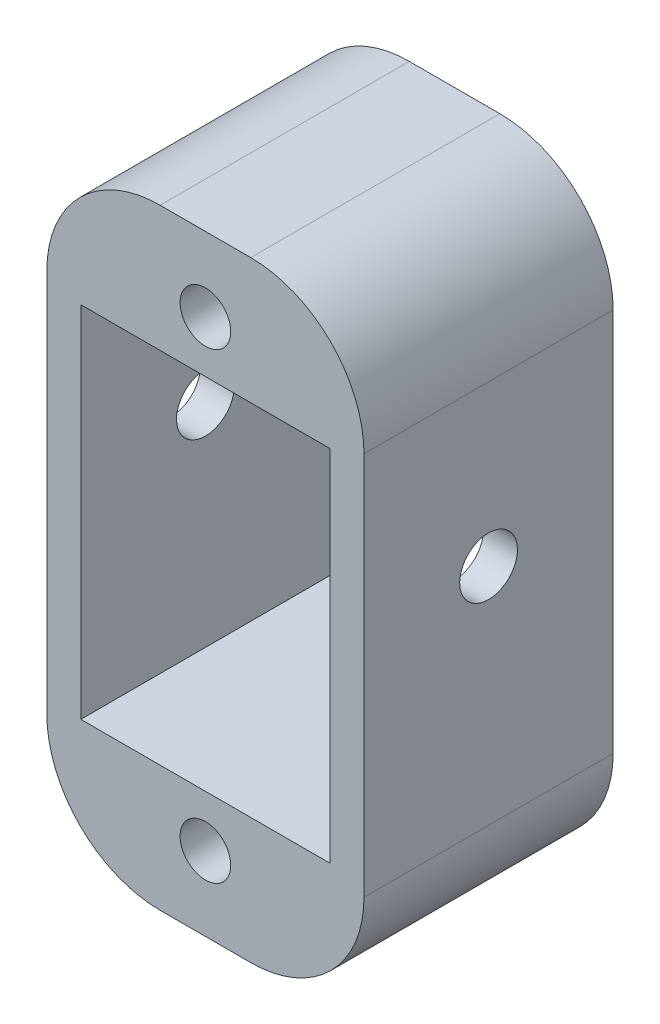
ISO-10303-21;
HEADER;
FILE_DESCRIPTION(('STEP AP214'),'2;1');
FILE_NAME('part.step','',(''),(''),'','','');
FILE_SCHEMA(('AUTOMOTIVE_DESIGN { 1 0 10303 214 1 1 1 1 }'));
ENDSEC;
DATA;
#1=APPLICATION_CONTEXT('core data for automotive mechanical design processes');
#2=APPLICATION_PROTOCOL_DEFINITION('international standard','automotive_design',2000,#1);
#3=PRODUCT_CONTEXT('',#1,'mechanical');
#4=PRODUCT('Part','Part','',(#3));
#5=PRODUCT_RELATED_PRODUCT_CATEGORY('part','',(#4));
#6=PRODUCT_DEFINITION_FORMATION('','',#4);
#7=PRODUCT_DEFINITION_CONTEXT('part definition',#1,'design');
#8=PRODUCT_DEFINITION('design','',#6,#7);
#9=PRODUCT_DEFINITION_SHAPE('','',#8);
#10=(LENGTH_UNIT() NAMED_UNIT(*) SI_UNIT(.MILLI.,.METRE.));
#11=(NAMED_UNIT(*) PLANE_ANGLE_UNIT() SI_UNIT($,.RADIAN.));
#12=(NAMED_UNIT(*) SI_UNIT($,.STERADIAN.) SOLID_ANGLE_UNIT());
#13=UNCERTAINTY_MEASURE_WITH_UNIT(LENGTH_MEASURE(1.E-05),#10,'distance_accuracy_value','');
#14=(GEOMETRIC_REPRESENTATION_CONTEXT(3) GLOBAL_UNCERTAINTY_ASSIGNED_CONTEXT((#13)) GLOBAL_UNIT_ASSIGNED_CONTEXT((#10,
#11,#12)) REPRESENTATION_CONTEXT('',''));
#15=CARTESIAN_POINT('',(0.,0.,0.));
#16=DIRECTION('',(0.,0.,1.));
#17=DIRECTION('',(1.,0.,0.));
#18=AXIS2_PLACEMENT_3D('',#15,#16,#17);
#19=CARTESIAN_POINT('',(3.88591708481307,-17.5541678256387,22.));
#20=DIRECTION('',(0.,0.,1.));
#21=DIRECTION('',(1.,0.,0.));
#22=AXIS2_PLACEMENT_3D('',#19,#20,#21);
#23=PLANE('',#22);
#24=CARTESIAN_POINT('',(-0.114082915186937,19.8058321743613,22.));
#25=DIRECTION('',(0.,0.,1.));
#26=DIRECTION('',(1.,0.,0.));
#27=AXIS2_PLACEMENT_3D('',#24,#25,#26);
#28=CIRCLE('',#27,2.23522254429092);
#29=CARTESIAN_POINT('',(2.12113962910399,19.8058321743613,22.));
#30=VERTEX_POINT('',#29);
#31=EDGE_CURVE('E155',#30,#30,#28,.T.);
#32=ORIENTED_EDGE('',*,*,#31,.F.);
#33=EDGE_LOOP('',(#32));
#34=FACE_BOUND('',#33,.T.);
#35=CARTESIAN_POINT('',(-0.114082915186937,-21.0041678256387,22.));
#36=DIRECTION('',(0.,0.,1.));
#37=DIRECTION('',(1.,0.,0.));
#38=AXIS2_PLACEMENT_3D('',#35,#36,#37);
#39=CIRCLE('',#38,2.23522254429093);
#40=CARTESIAN_POINT('',(2.12113962910399,-21.0041678256387,22.));
#41=VERTEX_POINT('',#40);
#42=EDGE_CURVE('E308',#41,#41,#39,.T.);
#43=ORIENTED_EDGE('',*,*,#42,.F.);
#44=EDGE_LOOP('',(#43));
#45=FACE_BOUND('',#44,.T.);
#46=CARTESIAN_POINT('',(3.88591708481307,-17.5541678256387,22.));
#47=DIRECTION('',(0.,0.,1.));
#48=DIRECTION('',(1.,0.,0.));
#49=AXIS2_PLACEMENT_3D('',#46,#47,#48);
#50=CIRCLE('',#49,10.);
#51=CARTESIAN_POINT('',(3.885917084813,-27.5541678256387,22.));
#52=VERTEX_POINT('',#51);
#53=CARTESIAN_POINT('',(13.8859170848131,-17.5541678256387,22.));
#54=VERTEX_POINT('',#53);
#55=EDGE_CURVE('E165',#52,#54,#50,.T.);
#56=ORIENTED_EDGE('',*,*,#55,.T.);
#57=DIRECTION('',(0.,1.,0.));
#58=VECTOR('',#57,1.);
#59=CARTESIAN_POINT('',(13.8859170848131,16.3558321743612,22.));
#60=LINE('',#59,#58);
#61=CARTESIAN_POINT('',(13.8859170848131,16.3558321743612,22.));
#62=VERTEX_POINT('',#61);
#63=EDGE_CURVE('E168',#54,#62,#60,.T.);
#64=ORIENTED_EDGE('',*,*,#63,.T.);
#65=CARTESIAN_POINT('',(3.88591708481306,16.3558321743613,22.));
#66=DIRECTION('',(0.,0.,1.));
#67=DIRECTION('',(-1.,0.,0.));
#68=AXIS2_PLACEMENT_3D('',#65,#66,#67);
#69=CIRCLE('',#68,10.);
#70=CARTESIAN_POINT('',(3.88591708481299,26.3558321743613,22.));
#71=VERTEX_POINT('',#70);
#72=EDGE_CURVE('E171',#62,#71,#69,.T.);
#73=ORIENTED_EDGE('',*,*,#72,.T.);
#74=DIRECTION('',(-1.,0.,0.));
#75=VECTOR('',#74,1.);
#76=CARTESIAN_POINT('',(-4.11408291518687,26.3558321743613,22.));
#77=LINE('',#76,#75);
#78=CARTESIAN_POINT('',(-4.11408291518686,26.3558321743613,22.));
#79=VERTEX_POINT('',#78);
#80=EDGE_CURVE('E173',#71,#79,#77,.T.);
#81=ORIENTED_EDGE('',*,*,#80,.T.);
#82=CARTESIAN_POINT('',(-4.11408291518694,16.3558321743613,22.));
#83=DIRECTION('',(0.,0.,1.));
#84=DIRECTION('',(1.,0.,0.));
#85=AXIS2_PLACEMENT_3D('',#82,#83,#84);
#86=CIRCLE('',#85,10.);
#87=CARTESIAN_POINT('',(-14.1140829151869,16.3558321743612,22.));
#88=VERTEX_POINT('',#87);
#89=EDGE_CURVE('E175',#79,#88,#86,.T.);
#90=ORIENTED_EDGE('',*,*,#89,.T.);
#91=DIRECTION('',(0.,-1.,0.));
#92=VECTOR('',#91,1.);
#93=CARTESIAN_POINT('',(-14.1140829151869,16.3558321743612,22.));
#94=LINE('',#93,#92);
#95=CARTESIAN_POINT('',(-14.1140829151869,-17.5541678256387,22.));
#96=VERTEX_POINT('',#95);
#97=EDGE_CURVE('E177',#88,#96,#94,.T.);
#98=ORIENTED_EDGE('',*,*,#97,.T.);
#99=CARTESIAN_POINT('',(-4.11408291518693,-17.5541678256387,22.));
#100=DIRECTION('',(0.,0.,1.));
#101=DIRECTION('',(1.,0.,0.));
#102=AXIS2_PLACEMENT_3D('',#99,#100,#101);
#103=CIRCLE('',#102,10.);
#104=CARTESIAN_POINT('',(-4.11408291518686,-27.5541678256387,22.));
#105=VERTEX_POINT('',#104);
#106=EDGE_CURVE('E179',#96,#105,#103,.T.);
#107=ORIENTED_EDGE('',*,*,#106,.T.);
#108=DIRECTION('',(1.,0.,0.));
#109=VECTOR('',#108,1.);
#110=CARTESIAN_POINT('',(-4.11408291518686,-27.5541678256387,22.));
#111=LINE('',#110,#109);
#112=EDGE_CURVE('E181',#105,#52,#111,.T.);
#113=ORIENTED_EDGE('',*,*,#112,.T.);
#114=EDGE_LOOP('',(#56,#64,#73,#81,#90,#98,#107,#113));
#115=FACE_BOUND('',#114,.T.);
#116=DIRECTION('',(1.,0.,0.));
#117=VECTOR('',#116,1.);
#118=CARTESIAN_POINT('',(10.8859170848131,-16.4541678256387,22.));
#119=LINE('',#118,#117);
#120=CARTESIAN_POINT('',(-11.1140829151869,-16.4541678256387,22.));
#121=VERTEX_POINT('',#120);
#122=CARTESIAN_POINT('',(10.8859170848131,-16.4541678256387,22.));
#123=VERTEX_POINT('',#122);
#124=EDGE_CURVE('E135',#121,#123,#119,.T.);
#125=ORIENTED_EDGE('',*,*,#124,.F.);
#126=DIRECTION('',(0.,-1.,0.));
#127=VECTOR('',#126,1.);
#128=CARTESIAN_POINT('',(-11.1140829151869,-16.4541678256387,22.));
#129=LINE('',#128,#127);
#130=CARTESIAN_POINT('',(-11.1140829151869,15.2558321743613,22.));
#131=VERTEX_POINT('',#130);
#132=EDGE_CURVE('E127',#131,#121,#129,.T.);
#133=ORIENTED_EDGE('',*,*,#132,.F.);
#134=DIRECTION('',(-1.,0.,0.));
#135=VECTOR('',#134,1.);
#136=CARTESIAN_POINT('',(-11.1140829151869,15.2558321743613,22.));
#137=LINE('',#136,#135);
#138=CARTESIAN_POINT('',(10.8859170848131,15.2558321743613,22.));
#139=VERTEX_POINT('',#138);
#140=EDGE_CURVE('E149',#139,#131,#137,.T.);
#141=ORIENTED_EDGE('',*,*,#140,.F.);
#142=DIRECTION('',(0.,1.,0.));
#143=VECTOR('',#142,1.);
#144=CARTESIAN_POINT('',(10.8859170848131,15.2558321743613,22.));
#145=LINE('',#144,#143);
#146=EDGE_CURVE('E147',#123,#139,#145,.T.);
#147=ORIENTED_EDGE('',*,*,#146,.F.);
#148=EDGE_LOOP('',(#125,#133,#141,#147));
#149=FACE_BOUND('',#148,.T.);
#150=ADVANCED_FACE('F37',(#34,#45,#115,#149),#23,.T.);
#151=CARTESIAN_POINT('',(3.88591708481307,-17.5541678256387,0.));
#152=DIRECTION('',(0.,0.,1.));
#153=DIRECTION('',(1.,0.,0.));
#154=AXIS2_PLACEMENT_3D('',#151,#152,#153);
#155=PLANE('',#154);
#156=CARTESIAN_POINT('',(-0.114082915186937,19.8058321743613,0.));
#157=DIRECTION('',(0.,0.,1.));
#158=DIRECTION('',(1.,0.,0.));
#159=AXIS2_PLACEMENT_3D('',#156,#157,#158);
#160=CIRCLE('',#159,2.23522254429092);
#161=CARTESIAN_POINT('',(2.12113962910399,19.8058321743613,0.));
#162=VERTEX_POINT('',#161);
#163=EDGE_CURVE('E305',#162,#162,#160,.T.);
#164=ORIENTED_EDGE('',*,*,#163,.T.);
#165=EDGE_LOOP('',(#164));
#166=FACE_BOUND('',#165,.T.);
#167=CARTESIAN_POINT('',(-0.114082915186937,-21.0041678256387,0.));
#168=DIRECTION('',(0.,0.,1.));
#169=DIRECTION('',(1.,0.,0.));
#170=AXIS2_PLACEMENT_3D('',#167,#168,#169);
#171=CIRCLE('',#170,2.23522254429093);
#172=CARTESIAN_POINT('',(2.12113962910399,-21.0041678256387,0.));
#173=VERTEX_POINT('',#172);
#174=EDGE_CURVE('E297',#173,#173,#171,.T.);
#175=ORIENTED_EDGE('',*,*,#174,.T.);
#176=EDGE_LOOP('',(#175));
#177=FACE_BOUND('',#176,.T.);
#178=CARTESIAN_POINT('',(3.88591708481307,-17.5541678256387,0.));
#179=DIRECTION('',(0.,0.,1.));
#180=DIRECTION('',(1.,0.,0.));
#181=AXIS2_PLACEMENT_3D('',#178,#179,#180);
#182=CIRCLE('',#181,10.);
#183=CARTESIAN_POINT('',(3.885917084813,-27.5541678256387,0.));
#184=VERTEX_POINT('',#183);
#185=CARTESIAN_POINT('',(13.8859170848131,-17.5541678256387,0.));
#186=VERTEX_POINT('',#185);
#187=EDGE_CURVE('E143',#184,#186,#182,.T.);
#188=ORIENTED_EDGE('',*,*,#187,.F.);
#189=DIRECTION('',(1.,0.,0.));
#190=VECTOR('',#189,1.);
#191=CARTESIAN_POINT('',(-4.11408291518686,-27.5541678256387,0.));
#192=LINE('',#191,#190);
#193=CARTESIAN_POINT('',(-4.11408291518686,-27.5541678256387,0.));
#194=VERTEX_POINT('',#193);
#195=EDGE_CURVE('E169',#194,#184,#192,.T.);
#196=ORIENTED_EDGE('',*,*,#195,.F.);
#197=CARTESIAN_POINT('',(-4.11408291518693,-17.5541678256387,0.));
#198=DIRECTION('',(0.,0.,1.));
#199=DIRECTION('',(1.,0.,0.));
#200=AXIS2_PLACEMENT_3D('',#197,#198,#199);
#201=CIRCLE('',#200,10.);
#202=CARTESIAN_POINT('',(-14.1140829151869,-17.5541678256387,0.));
#203=VERTEX_POINT('',#202);
#204=EDGE_CURVE('E196',#203,#194,#201,.T.);
#205=ORIENTED_EDGE('',*,*,#204,.F.);
#206=DIRECTION('',(0.,-1.,0.));
#207=VECTOR('',#206,1.);
#208=CARTESIAN_POINT('',(-14.1140829151869,16.3558321743612,0.));
#209=LINE('',#208,#207);
#210=CARTESIAN_POINT('',(-14.1140829151869,16.3558321743612,0.));
#211=VERTEX_POINT('',#210);
#212=EDGE_CURVE('E194',#211,#203,#209,.T.);
#213=ORIENTED_EDGE('',*,*,#212,.F.);
#214=CARTESIAN_POINT('',(-4.11408291518694,16.3558321743613,0.));
#215=DIRECTION('',(0.,0.,1.));
#216=DIRECTION('',(1.,0.,0.));
#217=AXIS2_PLACEMENT_3D('',#214,#215,#216);
#218=CIRCLE('',#217,10.);
#219=CARTESIAN_POINT('',(-4.11408291518686,26.3558321743613,0.));
#220=VERTEX_POINT('',#219);
#221=EDGE_CURVE('E192',#220,#211,#218,.T.);
#222=ORIENTED_EDGE('',*,*,#221,.F.);
#223=DIRECTION('',(-1.,0.,0.));
#224=VECTOR('',#223,1.);
#225=CARTESIAN_POINT('',(-4.11408291518687,26.3558321743613,0.));
#226=LINE('',#225,#224);
#227=CARTESIAN_POINT('',(3.88591708481299,26.3558321743613,0.));
#228=VERTEX_POINT('',#227);
#229=EDGE_CURVE('E190',#228,#220,#226,.T.);
#230=ORIENTED_EDGE('',*,*,#229,.F.);
#231=CARTESIAN_POINT('',(3.88591708481306,16.3558321743613,0.));
#232=DIRECTION('',(0.,0.,1.));
#233=DIRECTION('',(-1.,0.,0.));
#234=AXIS2_PLACEMENT_3D('',#231,#232,#233);
#235=CIRCLE('',#234,10.);
#236=CARTESIAN_POINT('',(13.8859170848131,16.3558321743612,0.));
#237=VERTEX_POINT('',#236);
#238=EDGE_CURVE('E188',#237,#228,#235,.T.);
#239=ORIENTED_EDGE('',*,*,#238,.F.);
#240=DIRECTION('',(0.,1.,0.));
#241=VECTOR('',#240,1.);
#242=CARTESIAN_POINT('',(13.8859170848131,16.3558321743612,0.));
#243=LINE('',#242,#241);
#244=EDGE_CURVE('E186',#186,#237,#243,.T.);
#245=ORIENTED_EDGE('',*,*,#244,.F.);
#246=EDGE_LOOP('',(#188,#196,#205,#213,#222,#230,#239,#245));
#247=FACE_BOUND('',#246,.T.);
#248=DIRECTION('',(0.,-1.,0.));
#249=VECTOR('',#248,1.);
#250=CARTESIAN_POINT('',(-11.1140829151869,-16.4541678256387,0.));
#251=LINE('',#250,#249);
#252=CARTESIAN_POINT('',(-11.1140829151869,15.2558321743613,0.));
#253=VERTEX_POINT('',#252);
#254=CARTESIAN_POINT('',(-11.1140829151869,-16.4541678256387,0.));
#255=VERTEX_POINT('',#254);
#256=EDGE_CURVE('E61',#253,#255,#251,.T.);
#257=ORIENTED_EDGE('',*,*,#256,.T.);
#258=DIRECTION('',(1.,0.,0.));
#259=VECTOR('',#258,1.);
#260=CARTESIAN_POINT('',(10.8859170848131,-16.4541678256387,0.));
#261=LINE('',#260,#259);
#262=CARTESIAN_POINT('',(10.8859170848131,-16.4541678256387,0.));
#263=VERTEX_POINT('',#262);
#264=EDGE_CURVE('E142',#255,#263,#261,.T.);
#265=ORIENTED_EDGE('',*,*,#264,.T.);
#266=DIRECTION('',(0.,1.,0.));
#267=VECTOR('',#266,1.);
#268=CARTESIAN_POINT('',(10.8859170848131,15.2558321743613,0.));
#269=LINE('',#268,#267);
#270=CARTESIAN_POINT('',(10.8859170848131,15.2558321743613,0.));
#271=VERTEX_POINT('',#270);
#272=EDGE_CURVE('E157',#263,#271,#269,.T.);
#273=ORIENTED_EDGE('',*,*,#272,.T.);
#274=DIRECTION('',(-1.,0.,0.));
#275=VECTOR('',#274,1.);
#276=CARTESIAN_POINT('',(-11.1140829151869,15.2558321743613,0.));
#277=LINE('',#276,#275);
#278=EDGE_CURVE('E136',#271,#253,#277,.T.);
#279=ORIENTED_EDGE('',*,*,#278,.T.);
#280=EDGE_LOOP('',(#257,#265,#273,#279));
#281=FACE_BOUND('',#280,.T.);
#282=ADVANCED_FACE('F227',(#166,#177,#247,#281),#155,.F.);
#283=CARTESIAN_POINT('',(3.88591708481307,-17.5541678256387,22.));
#284=DIRECTION('',(0.,0.,-1.));
#285=DIRECTION('',(-1.,0.,0.));
#286=AXIS2_PLACEMENT_3D('',#283,#284,#285);
#287=CYLINDRICAL_SURFACE('',#286,10.);
#288=ORIENTED_EDGE('',*,*,#187,.T.);
#289=DIRECTION('',(0.,0.,-1.));
#290=VECTOR('',#289,1.);
#291=CARTESIAN_POINT('',(13.8859170848131,-17.5541678256387,22.));
#292=LINE('',#291,#290);
#293=EDGE_CURVE('E11',#54,#186,#292,.T.);
#294=ORIENTED_EDGE('',*,*,#293,.F.);
#295=ORIENTED_EDGE('',*,*,#55,.F.);
#296=DIRECTION('',(0.,0.,-1.));
#297=VECTOR('',#296,1.);
#298=CARTESIAN_POINT('',(3.885917084813,-27.5541678256387,22.));
#299=LINE('',#298,#297);
#300=EDGE_CURVE('E183',#52,#184,#299,.T.);
#301=ORIENTED_EDGE('',*,*,#300,.T.);
#302=EDGE_LOOP('',(#288,#294,#295,#301));
#303=FACE_BOUND('',#302,.T.);
#304=ADVANCED_FACE('F39',(#303),#287,.T.);
#305=CARTESIAN_POINT('',(13.8859170848131,16.3558321743612,22.));
#306=DIRECTION('',(-1.,0.,0.));
#307=DIRECTION('',(0.,-1.,0.));
#308=AXIS2_PLACEMENT_3D('',#305,#306,#307);
#309=PLANE('',#308);
#310=CARTESIAN_POINT('',(13.8859170848131,2.25583217436127,11.));
#311=DIRECTION('',(-1.,0.,0.));
#312=DIRECTION('',(0.,-1.,0.));
#313=AXIS2_PLACEMENT_3D('',#310,#311,#312);
#314=CIRCLE('',#313,2.55);
#315=CARTESIAN_POINT('',(13.8859170848131,-0.294167825638735,11.));
#316=VERTEX_POINT('',#315);
#317=EDGE_CURVE('E294',#316,#316,#314,.T.);
#318=ORIENTED_EDGE('',*,*,#317,.T.);
#319=EDGE_LOOP('',(#318));
#320=FACE_BOUND('',#319,.T.);
#321=ORIENTED_EDGE('',*,*,#244,.T.);
#322=DIRECTION('',(0.,0.,-1.));
#323=VECTOR('',#322,1.);
#324=CARTESIAN_POINT('',(13.8859170848131,16.3558321743612,22.));
#325=LINE('',#324,#323);
#326=EDGE_CURVE('E46',#62,#237,#325,.T.);
#327=ORIENTED_EDGE('',*,*,#326,.F.);
#328=ORIENTED_EDGE('',*,*,#63,.F.);
#329=ORIENTED_EDGE('',*,*,#293,.T.);
#330=EDGE_LOOP('',(#321,#327,#328,#329));
#331=FACE_BOUND('',#330,.T.);
#332=ADVANCED_FACE('F244',(#320,#331),#309,.F.);
#333=CARTESIAN_POINT('',(3.88591708481306,16.3558321743613,22.));
#334=DIRECTION('',(0.,0.,-1.));
#335=DIRECTION('',(-1.,0.,0.));
#336=AXIS2_PLACEMENT_3D('',#333,#334,#335);
#337=CYLINDRICAL_SURFACE('',#336,10.);
#338=ORIENTED_EDGE('',*,*,#238,.T.);
#339=DIRECTION('',(0.,0.,-1.));
#340=VECTOR('',#339,1.);
#341=CARTESIAN_POINT('',(3.88591708481299,26.3558321743613,22.));
#342=LINE('',#341,#340);
#343=EDGE_CURVE('E213',#71,#228,#342,.T.);
#344=ORIENTED_EDGE('',*,*,#343,.F.);
#345=ORIENTED_EDGE('',*,*,#72,.F.);
#346=ORIENTED_EDGE('',*,*,#326,.T.);
#347=EDGE_LOOP('',(#338,#344,#345,#346));
#348=FACE_BOUND('',#347,.T.);
#349=ADVANCED_FACE('F221',(#348),#337,.T.);
#350=CARTESIAN_POINT('',(-4.11408291518687,26.3558321743613,22.));
#351=DIRECTION('',(0.,-1.,0.));
#352=DIRECTION('',(0.,0.,-1.));
#353=AXIS2_PLACEMENT_3D('',#350,#351,#352);
#354=PLANE('',#353);
#355=ORIENTED_EDGE('',*,*,#229,.T.);
#356=DIRECTION('',(0.,0.,-1.));
#357=VECTOR('',#356,1.);
#358=CARTESIAN_POINT('',(-4.11408291518686,26.3558321743613,22.));
#359=LINE('',#358,#357);
#360=EDGE_CURVE('E210',#79,#220,#359,.T.);
#361=ORIENTED_EDGE('',*,*,#360,.F.);
#362=ORIENTED_EDGE('',*,*,#80,.F.);
#363=ORIENTED_EDGE('',*,*,#343,.T.);
#364=EDGE_LOOP('',(#355,#361,#362,#363));
#365=FACE_BOUND('',#364,.T.);
#366=ADVANCED_FACE('F233',(#365),#354,.F.);
#367=CARTESIAN_POINT('',(-4.11408291518694,16.3558321743613,22.));
#368=DIRECTION('',(0.,0.,-1.));
#369=DIRECTION('',(-1.,0.,0.));
#370=AXIS2_PLACEMENT_3D('',#367,#368,#369);
#371=CYLINDRICAL_SURFACE('',#370,10.);
#372=ORIENTED_EDGE('',*,*,#221,.T.);
#373=DIRECTION('',(0.,0.,-1.));
#374=VECTOR('',#373,1.);
#375=CARTESIAN_POINT('',(-14.1140829151869,16.3558321743612,22.));
#376=LINE('',#375,#374);
#377=EDGE_CURVE('E207',#88,#211,#376,.T.);
#378=ORIENTED_EDGE('',*,*,#377,.F.);
#379=ORIENTED_EDGE('',*,*,#89,.F.);
#380=ORIENTED_EDGE('',*,*,#360,.T.);
#381=EDGE_LOOP('',(#372,#378,#379,#380));
#382=FACE_BOUND('',#381,.T.);
#383=ADVANCED_FACE('F237',(#382),#371,.T.);
#384=CARTESIAN_POINT('',(-14.1140829151869,16.3558321743612,22.));
#385=DIRECTION('',(1.,0.,0.));
#386=DIRECTION('',(0.,1.,0.));
#387=AXIS2_PLACEMENT_3D('',#384,#385,#386);
#388=PLANE('',#387);
#389=CARTESIAN_POINT('',(-14.1140829151869,2.25583217436126,11.));
#390=DIRECTION('',(1.,0.,0.));
#391=DIRECTION('',(0.,1.,0.));
#392=AXIS2_PLACEMENT_3D('',#389,#390,#391);
#393=CIRCLE('',#392,2.55);
#394=CARTESIAN_POINT('',(-14.1140829151869,4.80583217436126,11.));
#395=VERTEX_POINT('',#394);
#396=EDGE_CURVE('E300',#395,#395,#393,.T.);
#397=ORIENTED_EDGE('',*,*,#396,.T.);
#398=EDGE_LOOP('',(#397));
#399=FACE_BOUND('',#398,.T.);
#400=ORIENTED_EDGE('',*,*,#212,.T.);
#401=DIRECTION('',(0.,0.,-1.));
#402=VECTOR('',#401,1.);
#403=CARTESIAN_POINT('',(-14.1140829151869,-17.5541678256387,22.));
#404=LINE('',#403,#402);
#405=EDGE_CURVE('E204',#96,#203,#404,.T.);
#406=ORIENTED_EDGE('',*,*,#405,.F.);
#407=ORIENTED_EDGE('',*,*,#97,.F.);
#408=ORIENTED_EDGE('',*,*,#377,.T.);
#409=EDGE_LOOP('',(#400,#406,#407,#408));
#410=FACE_BOUND('',#409,.T.);
#411=ADVANCED_FACE('F257',(#399,#410),#388,.F.);
#412=CARTESIAN_POINT('',(-4.11408291518693,-17.5541678256387,22.));
#413=DIRECTION('',(0.,0.,-1.));
#414=DIRECTION('',(-1.,0.,0.));
#415=AXIS2_PLACEMENT_3D('',#412,#413,#414);
#416=CYLINDRICAL_SURFACE('',#415,10.);
#417=ORIENTED_EDGE('',*,*,#204,.T.);
#418=DIRECTION('',(0.,0.,-1.));
#419=VECTOR('',#418,1.);
#420=CARTESIAN_POINT('',(-4.11408291518686,-27.5541678256387,22.));
#421=LINE('',#420,#419);
#422=EDGE_CURVE('E201',#105,#194,#421,.T.);
#423=ORIENTED_EDGE('',*,*,#422,.F.);
#424=ORIENTED_EDGE('',*,*,#106,.F.);
#425=ORIENTED_EDGE('',*,*,#405,.T.);
#426=EDGE_LOOP('',(#417,#423,#424,#425));
#427=FACE_BOUND('',#426,.T.);
#428=ADVANCED_FACE('F255',(#427),#416,.T.);
#429=CARTESIAN_POINT('',(-4.11408291518686,-27.5541678256387,22.));
#430=DIRECTION('',(0.,1.,0.));
#431=DIRECTION('',(0.,0.,1.));
#432=AXIS2_PLACEMENT_3D('',#429,#430,#431);
#433=PLANE('',#432);
#434=ORIENTED_EDGE('',*,*,#195,.T.);
#435=ORIENTED_EDGE('',*,*,#300,.F.);
#436=ORIENTED_EDGE('',*,*,#112,.F.);
#437=ORIENTED_EDGE('',*,*,#422,.T.);
#438=EDGE_LOOP('',(#434,#435,#436,#437));
#439=FACE_BOUND('',#438,.T.);
#440=ADVANCED_FACE('F250',(#439),#433,.F.);
#441=CARTESIAN_POINT('',(-11.1140829151869,-16.4541678256387,22.));
#442=DIRECTION('',(1.,0.,0.));
#443=DIRECTION('',(0.,0.,-1.));
#444=AXIS2_PLACEMENT_3D('',#441,#442,#443);
#445=PLANE('',#444);
#446=CARTESIAN_POINT('',(-11.1140829151869,2.25583217436126,11.));
#447=DIRECTION('',(1.,0.,0.));
#448=DIRECTION('',(0.,0.,-1.));
#449=AXIS2_PLACEMENT_3D('',#446,#447,#448);
#450=CIRCLE('',#449,2.55);
#451=CARTESIAN_POINT('',(-11.1140829151869,2.25583217436126,8.45));
#452=VERTEX_POINT('',#451);
#453=EDGE_CURVE('E292',#452,#452,#450,.T.);
#454=ORIENTED_EDGE('',*,*,#453,.F.);
#455=EDGE_LOOP('',(#454));
#456=FACE_BOUND('',#455,.T.);
#457=ORIENTED_EDGE('',*,*,#256,.F.);
#458=DIRECTION('',(0.,0.,-1.));
#459=VECTOR('',#458,1.);
#460=CARTESIAN_POINT('',(-11.1140829151869,15.2558321743613,22.));
#461=LINE('',#460,#459);
#462=EDGE_CURVE('E131',#131,#253,#461,.T.);
#463=ORIENTED_EDGE('',*,*,#462,.F.);
#464=ORIENTED_EDGE('',*,*,#132,.T.);
#465=DIRECTION('',(0.,0.,-1.));
#466=VECTOR('',#465,1.);
#467=CARTESIAN_POINT('',(-11.1140829151869,-16.4541678256387,22.));
#468=LINE('',#467,#466);
#469=EDGE_CURVE('E130',#121,#255,#468,.T.);
#470=ORIENTED_EDGE('',*,*,#469,.T.);
#471=EDGE_LOOP('',(#457,#463,#464,#470));
#472=FACE_BOUND('',#471,.T.);
#473=ADVANCED_FACE('F129',(#456,#472),#445,.T.);
#474=CARTESIAN_POINT('',(10.8859170848131,-16.4541678256387,22.));
#475=DIRECTION('',(0.,1.,0.));
#476=DIRECTION('',(-1.,0.,0.));
#477=AXIS2_PLACEMENT_3D('',#474,#475,#476);
#478=PLANE('',#477);
#479=ORIENTED_EDGE('',*,*,#264,.F.);
#480=ORIENTED_EDGE('',*,*,#469,.F.);
#481=ORIENTED_EDGE('',*,*,#124,.T.);
#482=DIRECTION('',(0.,0.,-1.));
#483=VECTOR('',#482,1.);
#484=CARTESIAN_POINT('',(10.8859170848131,-16.4541678256387,22.));
#485=LINE('',#484,#483);
#486=EDGE_CURVE('E144',#123,#263,#485,.T.);
#487=ORIENTED_EDGE('',*,*,#486,.T.);
#488=EDGE_LOOP('',(#479,#480,#481,#487));
#489=FACE_BOUND('',#488,.T.);
#490=ADVANCED_FACE('F139',(#489),#478,.T.);
#491=CARTESIAN_POINT('',(10.8859170848131,15.2558321743613,22.));
#492=DIRECTION('',(-1.,0.,0.));
#493=DIRECTION('',(0.,-1.,0.));
#494=AXIS2_PLACEMENT_3D('',#491,#492,#493);
#495=PLANE('',#494);
#496=CARTESIAN_POINT('',(10.8859170848131,2.25583217436127,11.));
#497=DIRECTION('',(-1.,0.,0.));
#498=DIRECTION('',(0.,-1.,0.));
#499=AXIS2_PLACEMENT_3D('',#496,#497,#498);
#500=CIRCLE('',#499,2.55);
#501=CARTESIAN_POINT('',(10.8859170848131,-0.294167825638735,11.));
#502=VERTEX_POINT('',#501);
#503=EDGE_CURVE('E41',#502,#502,#500,.T.);
#504=ORIENTED_EDGE('',*,*,#503,.F.);
#505=EDGE_LOOP('',(#504));
#506=FACE_BOUND('',#505,.T.);
#507=ORIENTED_EDGE('',*,*,#272,.F.);
#508=ORIENTED_EDGE('',*,*,#486,.F.);
#509=ORIENTED_EDGE('',*,*,#146,.T.);
#510=DIRECTION('',(0.,0.,-1.));
#511=VECTOR('',#510,1.);
#512=CARTESIAN_POINT('',(10.8859170848131,15.2558321743613,22.));
#513=LINE('',#512,#511);
#514=EDGE_CURVE('E53',#139,#271,#513,.T.);
#515=ORIENTED_EDGE('',*,*,#514,.T.);
#516=EDGE_LOOP('',(#507,#508,#509,#515));
#517=FACE_BOUND('',#516,.T.);
#518=ADVANCED_FACE('F289',(#506,#517),#495,.T.);
#519=CARTESIAN_POINT('',(-11.1140829151869,15.2558321743613,22.));
#520=DIRECTION('',(0.,-1.,0.));
#521=DIRECTION('',(0.,0.,-1.));
#522=AXIS2_PLACEMENT_3D('',#519,#520,#521);
#523=PLANE('',#522);
#524=ORIENTED_EDGE('',*,*,#278,.F.);
#525=ORIENTED_EDGE('',*,*,#514,.F.);
#526=ORIENTED_EDGE('',*,*,#140,.T.);
#527=ORIENTED_EDGE('',*,*,#462,.T.);
#528=EDGE_LOOP('',(#524,#525,#526,#527));
#529=FACE_BOUND('',#528,.T.);
#530=ADVANCED_FACE('F317',(#529),#523,.T.);
#531=CARTESIAN_POINT('',(-0.114082915186937,-21.0041678256387,22.));
#532=DIRECTION('',(0.,0.,-1.));
#533=DIRECTION('',(-1.,0.,0.));
#534=AXIS2_PLACEMENT_3D('',#531,#532,#533);
#535=CYLINDRICAL_SURFACE('',#534,2.23522254429093);
#536=ORIENTED_EDGE('',*,*,#42,.T.);
#537=EDGE_LOOP('',(#536));
#538=FACE_BOUND('',#537,.T.);
#539=ORIENTED_EDGE('',*,*,#174,.F.);
#540=EDGE_LOOP('',(#539));
#541=FACE_BOUND('',#540,.T.);
#542=ADVANCED_FACE('F314',(#538,#541),#535,.F.);
#543=CARTESIAN_POINT('',(-0.114082915186937,19.8058321743613,22.));
#544=DIRECTION('',(0.,0.,-1.));
#545=DIRECTION('',(-1.,0.,0.));
#546=AXIS2_PLACEMENT_3D('',#543,#544,#545);
#547=CYLINDRICAL_SURFACE('',#546,2.23522254429092);
#548=ORIENTED_EDGE('',*,*,#31,.T.);
#549=EDGE_LOOP('',(#548));
#550=FACE_BOUND('',#549,.T.);
#551=ORIENTED_EDGE('',*,*,#163,.F.);
#552=EDGE_LOOP('',(#551));
#553=FACE_BOUND('',#552,.T.);
#554=ADVANCED_FACE('F316',(#550,#553),#547,.F.);
#555=CARTESIAN_POINT('',(-14.1140829151869,2.25583217436126,11.));
#556=DIRECTION('',(1.,0.,0.));
#557=DIRECTION('',(0.,1.,0.));
#558=AXIS2_PLACEMENT_3D('',#555,#556,#557);
#559=CYLINDRICAL_SURFACE('',#558,2.55);
#560=ORIENTED_EDGE('',*,*,#503,.T.);
#561=EDGE_LOOP('',(#560));
#562=FACE_BOUND('',#561,.T.);
#563=ORIENTED_EDGE('',*,*,#317,.F.);
#564=EDGE_LOOP('',(#563));
#565=FACE_BOUND('',#564,.T.);
#566=ADVANCED_FACE('F324',(#562,#565),#559,.F.);
#567=ORIENTED_EDGE('',*,*,#453,.T.);
#568=EDGE_LOOP('',(#567));
#569=FACE_BOUND('',#568,.T.);
#570=ORIENTED_EDGE('',*,*,#396,.F.);
#571=EDGE_LOOP('',(#570));
#572=FACE_BOUND('',#571,.T.);
#573=ADVANCED_FACE('F340',(#569,#572),#559,.F.);
#574=CLOSED_SHELL('',(#150,#282,#304,#332,#349,#366,#383,#411,#428,#440,#473,#490,#518,#530,
#542,#554,#566,#573));
#575=MANIFOLD_SOLID_BREP('B2',#574);
#576=ADVANCED_BREP_SHAPE_REPRESENTATION('',(#18,#575),#14);
#577=SHAPE_DEFINITION_REPRESENTATION(#9,#576);
ENDSEC;
END-ISO-10303-21;
